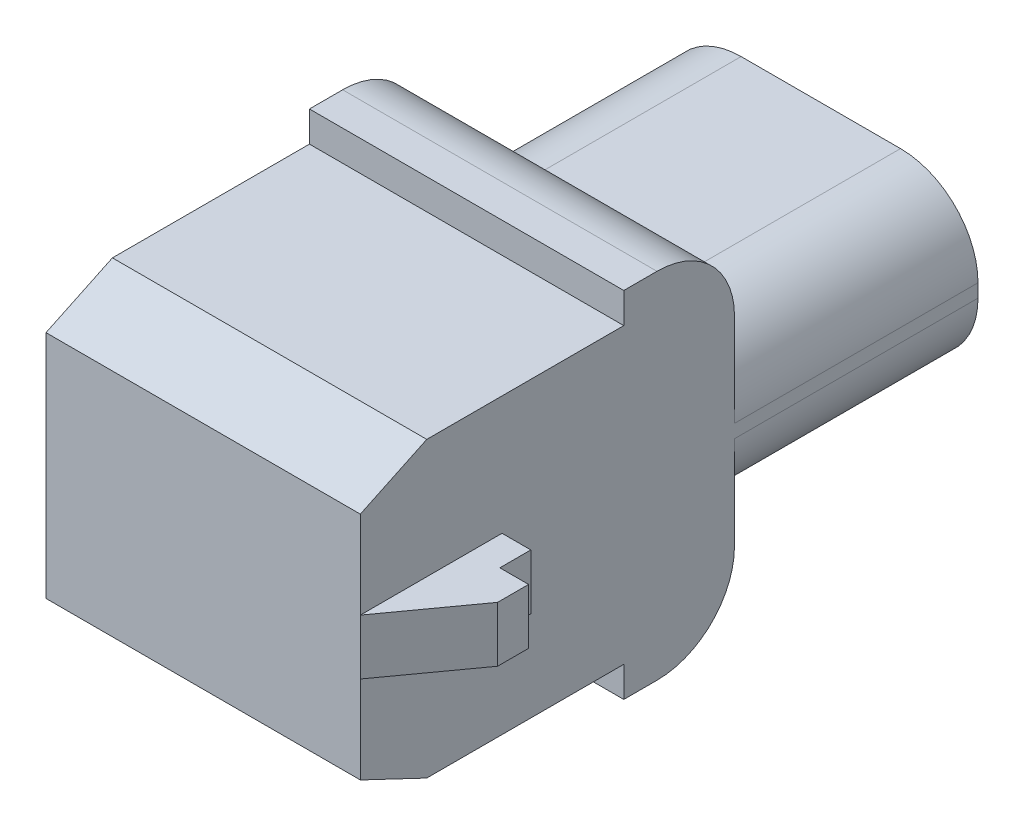
ISO-10303-21;
HEADER;
FILE_DESCRIPTION(('STEP AP214'),'2;1');
FILE_NAME('part.step','',(''),(''),'','','');
FILE_SCHEMA(('AUTOMOTIVE_DESIGN { 1 0 10303 214 1 1 1 1 }'));
ENDSEC;
DATA;
#1=APPLICATION_CONTEXT('core data for automotive mechanical design processes');
#2=APPLICATION_PROTOCOL_DEFINITION('international standard','automotive_design',2000,#1);
#3=PRODUCT_CONTEXT('',#1,'mechanical');
#4=PRODUCT('Part','Part','',(#3));
#5=PRODUCT_RELATED_PRODUCT_CATEGORY('part','',(#4));
#6=PRODUCT_DEFINITION_FORMATION('','',#4);
#7=PRODUCT_DEFINITION_CONTEXT('part definition',#1,'design');
#8=PRODUCT_DEFINITION('design','',#6,#7);
#9=PRODUCT_DEFINITION_SHAPE('','',#8);
#10=(LENGTH_UNIT() NAMED_UNIT(*) SI_UNIT(.MILLI.,.METRE.));
#11=(NAMED_UNIT(*) PLANE_ANGLE_UNIT() SI_UNIT($,.RADIAN.));
#12=(NAMED_UNIT(*) SI_UNIT($,.STERADIAN.) SOLID_ANGLE_UNIT());
#13=UNCERTAINTY_MEASURE_WITH_UNIT(LENGTH_MEASURE(1.E-05),#10,'distance_accuracy_value','');
#14=(GEOMETRIC_REPRESENTATION_CONTEXT(3) GLOBAL_UNCERTAINTY_ASSIGNED_CONTEXT((#13)) GLOBAL_UNIT_ASSIGNED_CONTEXT((#10,
#11,#12)) REPRESENTATION_CONTEXT('',''));
#15=CARTESIAN_POINT('',(0.,0.,0.));
#16=DIRECTION('',(0.,0.,1.));
#17=DIRECTION('',(1.,0.,0.));
#18=AXIS2_PLACEMENT_3D('',#15,#16,#17);
#19=CARTESIAN_POINT('',(7.1,0.,0.));
#20=DIRECTION('',(-1.,0.,0.));
#21=DIRECTION('',(0.,0.,1.));
#22=AXIS2_PLACEMENT_3D('',#19,#20,#21);
#23=PLANE('',#22);
#24=DIRECTION('',(0.,0.,1.));
#25=VECTOR('',#24,1.);
#26=CARTESIAN_POINT('',(7.1,-1.25,10.5));
#27=LINE('',#26,#25);
#28=CARTESIAN_POINT('',(7.1,-1.25,10.5));
#29=VERTEX_POINT('',#28);
#30=CARTESIAN_POINT('',(7.1,-1.25,16.9));
#31=VERTEX_POINT('',#30);
#32=EDGE_CURVE('E540',#29,#31,#27,.T.);
#33=ORIENTED_EDGE('',*,*,#32,.T.);
#34=DIRECTION('',(0.,-1.,0.));
#35=VECTOR('',#34,1.);
#36=CARTESIAN_POINT('',(7.1,5.2,16.9));
#37=LINE('',#36,#35);
#38=CARTESIAN_POINT('',(7.1,-5.2,16.9));
#39=VERTEX_POINT('',#38);
#40=EDGE_CURVE('E266',#31,#39,#37,.T.);
#41=ORIENTED_EDGE('',*,*,#40,.T.);
#42=DIRECTION('',(0.,-0.429056814568288,-0.90327750435429));
#43=VECTOR('',#42,1.);
#44=CARTESIAN_POINT('',(7.1,-6.625,13.9));
#45=LINE('',#44,#43);
#46=CARTESIAN_POINT('',(7.1,-6.625,13.9));
#47=VERTEX_POINT('',#46);
#48=EDGE_CURVE('E274',#39,#47,#45,.T.);
#49=ORIENTED_EDGE('',*,*,#48,.T.);
#50=DIRECTION('',(0.,0.,-1.));
#51=VECTOR('',#50,1.);
#52=CARTESIAN_POINT('',(7.1,-6.625,5.));
#53=LINE('',#52,#51);
#54=CARTESIAN_POINT('',(7.1,-6.625,5.));
#55=VERTEX_POINT('',#54);
#56=EDGE_CURVE('E277',#47,#55,#53,.T.);
#57=ORIENTED_EDGE('',*,*,#56,.T.);
#58=DIRECTION('',(0.,-1.,0.));
#59=VECTOR('',#58,1.);
#60=CARTESIAN_POINT('',(7.1,-8.,5.));
#61=LINE('',#60,#59);
#62=CARTESIAN_POINT('',(7.1,-8.,5.));
#63=VERTEX_POINT('',#62);
#64=EDGE_CURVE('E284',#55,#63,#61,.T.);
#65=ORIENTED_EDGE('',*,*,#64,.T.);
#66=DIRECTION('',(0.,0.,-1.));
#67=VECTOR('',#66,1.);
#68=CARTESIAN_POINT('',(7.1,-8.,0.));
#69=LINE('',#68,#67);
#70=CARTESIAN_POINT('',(7.1,-8.,3.5));
#71=VERTEX_POINT('',#70);
#72=EDGE_CURVE('E287',#63,#71,#69,.T.);
#73=ORIENTED_EDGE('',*,*,#72,.T.);
#74=CARTESIAN_POINT('',(7.1,-4.5,3.5));
#75=DIRECTION('',(-1.,0.,0.));
#76=DIRECTION('',(0.,0.,1.));
#77=AXIS2_PLACEMENT_3D('',#74,#75,#76);
#78=CIRCLE('',#77,3.5);
#79=CARTESIAN_POINT('',(7.1,-4.5,0.));
#80=VERTEX_POINT('',#79);
#81=EDGE_CURVE('E388',#71,#80,#78,.F.);
#82=ORIENTED_EDGE('',*,*,#81,.T.);
#83=DIRECTION('',(0.,1.,0.));
#84=VECTOR('',#83,1.);
#85=CARTESIAN_POINT('',(7.1,-3.8,0.));
#86=LINE('',#85,#84);
#87=CARTESIAN_POINT('',(7.1,-0.3,0.));
#88=VERTEX_POINT('',#87);
#89=EDGE_CURVE('E290',#80,#88,#86,.T.);
#90=ORIENTED_EDGE('',*,*,#89,.T.);
#91=DIRECTION('',(0.,0.,-1.));
#92=VECTOR('',#91,1.);
#93=CARTESIAN_POINT('',(7.1,-0.3,-11.));
#94=LINE('',#93,#92);
#95=CARTESIAN_POINT('',(7.1,-0.300000000000001,-11.));
#96=VERTEX_POINT('',#95);
#97=EDGE_CURVE('E393',#88,#96,#94,.T.);
#98=ORIENTED_EDGE('',*,*,#97,.T.);
#99=DIRECTION('',(0.,1.,0.));
#100=VECTOR('',#99,1.);
#101=CARTESIAN_POINT('',(7.1,-3.8,-11.));
#102=LINE('',#101,#100);
#103=CARTESIAN_POINT('',(7.1,0.299999999999998,-11.));
#104=VERTEX_POINT('',#103);
#105=EDGE_CURVE('E292',#96,#104,#102,.T.);
#106=ORIENTED_EDGE('',*,*,#105,.T.);
#107=DIRECTION('',(0.,0.,1.));
#108=VECTOR('',#107,1.);
#109=CARTESIAN_POINT('',(7.1,0.3,0.));
#110=LINE('',#109,#108);
#111=CARTESIAN_POINT('',(7.1,0.3,0.));
#112=VERTEX_POINT('',#111);
#113=EDGE_CURVE('E390',#104,#112,#110,.T.);
#114=ORIENTED_EDGE('',*,*,#113,.T.);
#115=DIRECTION('',(0.,1.,0.));
#116=VECTOR('',#115,1.);
#117=CARTESIAN_POINT('',(7.1,3.8,0.));
#118=LINE('',#117,#116);
#119=CARTESIAN_POINT('',(7.1,4.5,0.));
#120=VERTEX_POINT('',#119);
#121=EDGE_CURVE('E433',#112,#120,#118,.T.);
#122=ORIENTED_EDGE('',*,*,#121,.T.);
#123=CARTESIAN_POINT('',(7.1,4.5,3.5));
#124=DIRECTION('',(-1.,0.,0.));
#125=DIRECTION('',(0.,0.,1.));
#126=AXIS2_PLACEMENT_3D('',#123,#124,#125);
#127=CIRCLE('',#126,3.5);
#128=CARTESIAN_POINT('',(7.1,8.,3.5));
#129=VERTEX_POINT('',#128);
#130=EDGE_CURVE('E386',#120,#129,#127,.F.);
#131=ORIENTED_EDGE('',*,*,#130,.T.);
#132=DIRECTION('',(0.,0.,1.));
#133=VECTOR('',#132,1.);
#134=CARTESIAN_POINT('',(7.1,8.,0.));
#135=LINE('',#134,#133);
#136=CARTESIAN_POINT('',(7.1,8.,5.));
#137=VERTEX_POINT('',#136);
#138=EDGE_CURVE('E436',#129,#137,#135,.T.);
#139=ORIENTED_EDGE('',*,*,#138,.T.);
#140=DIRECTION('',(0.,-1.,0.));
#141=VECTOR('',#140,1.);
#142=CARTESIAN_POINT('',(7.1,8.,5.));
#143=LINE('',#142,#141);
#144=CARTESIAN_POINT('',(7.1,6.625,5.));
#145=VERTEX_POINT('',#144);
#146=EDGE_CURVE('E439',#137,#145,#143,.T.);
#147=ORIENTED_EDGE('',*,*,#146,.T.);
#148=DIRECTION('',(0.,0.,1.));
#149=VECTOR('',#148,1.);
#150=CARTESIAN_POINT('',(7.1,6.625,5.));
#151=LINE('',#150,#149);
#152=CARTESIAN_POINT('',(7.1,6.625,13.9));
#153=VERTEX_POINT('',#152);
#154=EDGE_CURVE('E449',#145,#153,#151,.T.);
#155=ORIENTED_EDGE('',*,*,#154,.T.);
#156=DIRECTION('',(0.,-0.429056814568288,0.90327750435429));
#157=VECTOR('',#156,1.);
#158=CARTESIAN_POINT('',(7.1,6.625,13.9));
#159=LINE('',#158,#157);
#160=CARTESIAN_POINT('',(7.1,5.2,16.9));
#161=VERTEX_POINT('',#160);
#162=EDGE_CURVE('E273',#153,#161,#159,.T.);
#163=ORIENTED_EDGE('',*,*,#162,.T.);
#164=CARTESIAN_POINT('',(7.1,1.25,16.9));
#165=VERTEX_POINT('',#164);
#166=EDGE_CURVE('E265',#161,#165,#37,.T.);
#167=ORIENTED_EDGE('',*,*,#166,.T.);
#168=DIRECTION('',(0.,0.,1.));
#169=VECTOR('',#168,1.);
#170=CARTESIAN_POINT('',(7.1,1.25,10.5));
#171=LINE('',#170,#169);
#172=CARTESIAN_POINT('',(7.1,1.25,10.5));
#173=VERTEX_POINT('',#172);
#174=EDGE_CURVE('E241',#173,#165,#171,.T.);
#175=ORIENTED_EDGE('',*,*,#174,.F.);
#176=DIRECTION('',(0.,1.,0.));
#177=VECTOR('',#176,1.);
#178=CARTESIAN_POINT('',(7.1,-1.25,10.5));
#179=LINE('',#178,#177);
#180=EDGE_CURVE('E267',#29,#173,#179,.T.);
#181=ORIENTED_EDGE('',*,*,#180,.F.);
#182=EDGE_LOOP('',(#33,#41,#49,#57,#65,#73,#82,#90,#98,#106,#114,#122,#131,#139,#147,#155,#163,
#167,#175,#181));
#183=FACE_BOUND('',#182,.T.);
#184=ADVANCED_FACE('F33',(#183),#23,.F.);
#185=CARTESIAN_POINT('',(-7.1,0.,0.));
#186=DIRECTION('',(-1.,0.,0.));
#187=DIRECTION('',(0.,0.,1.));
#188=AXIS2_PLACEMENT_3D('',#185,#186,#187);
#189=PLANE('',#188);
#190=DIRECTION('',(0.,-1.,0.));
#191=VECTOR('',#190,1.);
#192=CARTESIAN_POINT('',(-7.1,5.2,16.9));
#193=LINE('',#192,#191);
#194=CARTESIAN_POINT('',(-7.1,-1.25,16.9));
#195=VERTEX_POINT('',#194);
#196=CARTESIAN_POINT('',(-7.1,-5.2,16.9));
#197=VERTEX_POINT('',#196);
#198=EDGE_CURVE('E309',#195,#197,#193,.T.);
#199=ORIENTED_EDGE('',*,*,#198,.F.);
#200=DIRECTION('',(0.,0.,-1.));
#201=VECTOR('',#200,1.);
#202=CARTESIAN_POINT('',(-7.1,-1.25,10.5));
#203=LINE('',#202,#201);
#204=CARTESIAN_POINT('',(-7.1,-1.25,10.5));
#205=VERTEX_POINT('',#204);
#206=EDGE_CURVE('E56',#195,#205,#203,.T.);
#207=ORIENTED_EDGE('',*,*,#206,.T.);
#208=DIRECTION('',(0.,1.,0.));
#209=VECTOR('',#208,1.);
#210=CARTESIAN_POINT('',(-7.1,-1.25,10.5));
#211=LINE('',#210,#209);
#212=CARTESIAN_POINT('',(-7.1,1.25,10.5));
#213=VERTEX_POINT('',#212);
#214=EDGE_CURVE('E445',#205,#213,#211,.T.);
#215=ORIENTED_EDGE('',*,*,#214,.T.);
#216=DIRECTION('',(0.,0.,-1.));
#217=VECTOR('',#216,1.);
#218=CARTESIAN_POINT('',(-7.1,1.25,10.5));
#219=LINE('',#218,#217);
#220=CARTESIAN_POINT('',(-7.1,1.25,16.9));
#221=VERTEX_POINT('',#220);
#222=EDGE_CURVE('E461',#221,#213,#219,.T.);
#223=ORIENTED_EDGE('',*,*,#222,.F.);
#224=CARTESIAN_POINT('',(-7.1,5.2,16.9));
#225=VERTEX_POINT('',#224);
#226=EDGE_CURVE('E310',#225,#221,#193,.T.);
#227=ORIENTED_EDGE('',*,*,#226,.F.);
#228=DIRECTION('',(0.,-0.429056814568288,0.90327750435429));
#229=VECTOR('',#228,1.);
#230=CARTESIAN_POINT('',(-7.1,6.625,13.9));
#231=LINE('',#230,#229);
#232=CARTESIAN_POINT('',(-7.1,6.625,13.9));
#233=VERTEX_POINT('',#232);
#234=EDGE_CURVE('E306',#233,#225,#231,.T.);
#235=ORIENTED_EDGE('',*,*,#234,.F.);
#236=DIRECTION('',(0.,0.,1.));
#237=VECTOR('',#236,1.);
#238=CARTESIAN_POINT('',(-7.1,6.625,5.));
#239=LINE('',#238,#237);
#240=CARTESIAN_POINT('',(-7.1,6.625,5.));
#241=VERTEX_POINT('',#240);
#242=EDGE_CURVE('E303',#241,#233,#239,.T.);
#243=ORIENTED_EDGE('',*,*,#242,.F.);
#244=DIRECTION('',(0.,-1.,0.));
#245=VECTOR('',#244,1.);
#246=CARTESIAN_POINT('',(-7.1,8.,5.));
#247=LINE('',#246,#245);
#248=CARTESIAN_POINT('',(-7.1,8.,5.));
#249=VERTEX_POINT('',#248);
#250=EDGE_CURVE('E300',#249,#241,#247,.T.);
#251=ORIENTED_EDGE('',*,*,#250,.F.);
#252=DIRECTION('',(0.,0.,1.));
#253=VECTOR('',#252,1.);
#254=CARTESIAN_POINT('',(-7.1,8.,0.));
#255=LINE('',#254,#253);
#256=CARTESIAN_POINT('',(-7.1,8.,3.5));
#257=VERTEX_POINT('',#256);
#258=EDGE_CURVE('E298',#257,#249,#255,.T.);
#259=ORIENTED_EDGE('',*,*,#258,.F.);
#260=CARTESIAN_POINT('',(-7.1,4.5,3.5));
#261=DIRECTION('',(-1.,0.,0.));
#262=DIRECTION('',(0.,0.,1.));
#263=AXIS2_PLACEMENT_3D('',#260,#261,#262);
#264=CIRCLE('',#263,3.5);
#265=CARTESIAN_POINT('',(-7.1,4.5,0.));
#266=VERTEX_POINT('',#265);
#267=EDGE_CURVE('E364',#257,#266,#264,.T.);
#268=ORIENTED_EDGE('',*,*,#267,.T.);
#269=DIRECTION('',(0.,1.,0.));
#270=VECTOR('',#269,1.);
#271=CARTESIAN_POINT('',(-7.1,3.8,0.));
#272=LINE('',#271,#270);
#273=CARTESIAN_POINT('',(-7.1,0.3,0.));
#274=VERTEX_POINT('',#273);
#275=EDGE_CURVE('E295',#274,#266,#272,.T.);
#276=ORIENTED_EDGE('',*,*,#275,.F.);
#277=DIRECTION('',(0.,0.,1.));
#278=VECTOR('',#277,1.);
#279=CARTESIAN_POINT('',(-7.1,0.3,0.));
#280=LINE('',#279,#278);
#281=CARTESIAN_POINT('',(-7.1,0.299999999999998,-11.));
#282=VERTEX_POINT('',#281);
#283=EDGE_CURVE('E371',#274,#282,#280,.F.);
#284=ORIENTED_EDGE('',*,*,#283,.T.);
#285=DIRECTION('',(0.,1.,0.));
#286=VECTOR('',#285,1.);
#287=CARTESIAN_POINT('',(-7.1,-3.8,-11.));
#288=LINE('',#287,#286);
#289=CARTESIAN_POINT('',(-7.1,-0.300000000000001,-11.));
#290=VERTEX_POINT('',#289);
#291=EDGE_CURVE('E327',#290,#282,#288,.T.);
#292=ORIENTED_EDGE('',*,*,#291,.F.);
#293=DIRECTION('',(0.,0.,-1.));
#294=VECTOR('',#293,1.);
#295=CARTESIAN_POINT('',(-7.1,-0.3,0.));
#296=LINE('',#295,#294);
#297=CARTESIAN_POINT('',(-7.1,-0.3,0.));
#298=VERTEX_POINT('',#297);
#299=EDGE_CURVE('E368',#290,#298,#296,.F.);
#300=ORIENTED_EDGE('',*,*,#299,.T.);
#301=DIRECTION('',(0.,1.,0.));
#302=VECTOR('',#301,1.);
#303=CARTESIAN_POINT('',(-7.1,-3.8,0.));
#304=LINE('',#303,#302);
#305=CARTESIAN_POINT('',(-7.1,-4.5,0.));
#306=VERTEX_POINT('',#305);
#307=EDGE_CURVE('E325',#306,#298,#304,.T.);
#308=ORIENTED_EDGE('',*,*,#307,.F.);
#309=CARTESIAN_POINT('',(-7.1,-4.5,3.5));
#310=DIRECTION('',(-1.,0.,0.));
#311=DIRECTION('',(0.,0.,1.));
#312=AXIS2_PLACEMENT_3D('',#309,#310,#311);
#313=CIRCLE('',#312,3.5);
#314=CARTESIAN_POINT('',(-7.1,-8.,3.5));
#315=VERTEX_POINT('',#314);
#316=EDGE_CURVE('E366',#306,#315,#313,.T.);
#317=ORIENTED_EDGE('',*,*,#316,.T.);
#318=DIRECTION('',(0.,0.,-1.));
#319=VECTOR('',#318,1.);
#320=CARTESIAN_POINT('',(-7.1,-8.,0.));
#321=LINE('',#320,#319);
#322=CARTESIAN_POINT('',(-7.1,-8.,5.));
#323=VERTEX_POINT('',#322);
#324=EDGE_CURVE('E322',#323,#315,#321,.T.);
#325=ORIENTED_EDGE('',*,*,#324,.F.);
#326=DIRECTION('',(0.,-1.,0.));
#327=VECTOR('',#326,1.);
#328=CARTESIAN_POINT('',(-7.1,-8.,5.));
#329=LINE('',#328,#327);
#330=CARTESIAN_POINT('',(-7.1,-6.625,5.));
#331=VERTEX_POINT('',#330);
#332=EDGE_CURVE('E319',#331,#323,#329,.T.);
#333=ORIENTED_EDGE('',*,*,#332,.F.);
#334=DIRECTION('',(0.,0.,-1.));
#335=VECTOR('',#334,1.);
#336=CARTESIAN_POINT('',(-7.1,-6.625,5.));
#337=LINE('',#336,#335);
#338=CARTESIAN_POINT('',(-7.1,-6.625,13.9));
#339=VERTEX_POINT('',#338);
#340=EDGE_CURVE('E316',#339,#331,#337,.T.);
#341=ORIENTED_EDGE('',*,*,#340,.F.);
#342=DIRECTION('',(0.,-0.429056814568288,-0.90327750435429));
#343=VECTOR('',#342,1.);
#344=CARTESIAN_POINT('',(-7.1,-6.625,13.9));
#345=LINE('',#344,#343);
#346=EDGE_CURVE('E313',#197,#339,#345,.T.);
#347=ORIENTED_EDGE('',*,*,#346,.F.);
#348=EDGE_LOOP('',(#199,#207,#215,#223,#227,#235,#243,#251,#259,#268,#276,#284,#292,#300,#308,
#317,#325,#333,#341,#347));
#349=FACE_BOUND('',#348,.T.);
#350=ADVANCED_FACE('F458',(#349),#189,.T.);
#351=CARTESIAN_POINT('',(-7.1,3.8,-11.));
#352=DIRECTION('',(0.,1.,0.));
#353=DIRECTION('',(0.,0.,1.));
#354=AXIS2_PLACEMENT_3D('',#351,#352,#353);
#355=PLANE('',#354);
#356=DIRECTION('',(1.,0.,0.));
#357=VECTOR('',#356,1.);
#358=CARTESIAN_POINT('',(-7.1,3.8,-11.));
#359=LINE('',#358,#357);
#360=CARTESIAN_POINT('',(-3.6,3.8,-11.));
#361=VERTEX_POINT('',#360);
#362=CARTESIAN_POINT('',(3.6,3.8,-11.));
#363=VERTEX_POINT('',#362);
#364=EDGE_CURVE('E331',#361,#363,#359,.T.);
#365=ORIENTED_EDGE('',*,*,#364,.F.);
#366=DIRECTION('',(0.,0.,1.));
#367=VECTOR('',#366,1.);
#368=CARTESIAN_POINT('',(-3.6,3.8,-11.));
#369=LINE('',#368,#367);
#370=CARTESIAN_POINT('',(-3.6,3.8,0.));
#371=VERTEX_POINT('',#370);
#372=EDGE_CURVE('E361',#361,#371,#369,.T.);
#373=ORIENTED_EDGE('',*,*,#372,.T.);
#374=DIRECTION('',(1.,0.,0.));
#375=VECTOR('',#374,1.);
#376=CARTESIAN_POINT('',(-7.1,3.8,0.));
#377=LINE('',#376,#375);
#378=CARTESIAN_POINT('',(3.6,3.8,0.));
#379=VERTEX_POINT('',#378);
#380=EDGE_CURVE('E330',#371,#379,#377,.T.);
#381=ORIENTED_EDGE('',*,*,#380,.T.);
#382=DIRECTION('',(0.,0.,1.));
#383=VECTOR('',#382,1.);
#384=CARTESIAN_POINT('',(3.6,3.8,-11.));
#385=LINE('',#384,#383);
#386=EDGE_CURVE('E334',#379,#363,#385,.F.);
#387=ORIENTED_EDGE('',*,*,#386,.T.);
#388=EDGE_LOOP('',(#365,#373,#381,#387));
#389=FACE_BOUND('',#388,.T.);
#390=ADVANCED_FACE('F597',(#389),#355,.T.);
#391=CARTESIAN_POINT('',(-7.1,-3.8,-11.));
#392=DIRECTION('',(0.,0.,-1.));
#393=DIRECTION('',(-1.,0.,0.));
#394=AXIS2_PLACEMENT_3D('',#391,#392,#393);
#395=PLANE('',#394);
#396=ORIENTED_EDGE('',*,*,#291,.T.);
#397=CARTESIAN_POINT('',(-3.6,0.3,-11.));
#398=DIRECTION('',(0.,0.,-1.));
#399=DIRECTION('',(-1.,0.,0.));
#400=AXIS2_PLACEMENT_3D('',#397,#398,#399);
#401=CIRCLE('',#400,3.5);
#402=EDGE_CURVE('E379',#282,#361,#401,.T.);
#403=ORIENTED_EDGE('',*,*,#402,.T.);
#404=ORIENTED_EDGE('',*,*,#364,.T.);
#405=CARTESIAN_POINT('',(3.6,0.3,-11.));
#406=DIRECTION('',(0.,0.,-1.));
#407=DIRECTION('',(-1.,0.,0.));
#408=AXIS2_PLACEMENT_3D('',#405,#406,#407);
#409=CIRCLE('',#408,3.5);
#410=EDGE_CURVE('E373',#363,#104,#409,.T.);
#411=ORIENTED_EDGE('',*,*,#410,.T.);
#412=ORIENTED_EDGE('',*,*,#105,.F.);
#413=CARTESIAN_POINT('',(3.6,-0.3,-11.));
#414=DIRECTION('',(0.,0.,-1.));
#415=DIRECTION('',(-1.,0.,0.));
#416=AXIS2_PLACEMENT_3D('',#413,#414,#415);
#417=CIRCLE('',#416,3.5);
#418=CARTESIAN_POINT('',(3.6,-3.8,-11.));
#419=VERTEX_POINT('',#418);
#420=EDGE_CURVE('E375',#96,#419,#417,.T.);
#421=ORIENTED_EDGE('',*,*,#420,.T.);
#422=DIRECTION('',(1.,0.,0.));
#423=VECTOR('',#422,1.);
#424=CARTESIAN_POINT('',(-7.1,-3.8,-11.));
#425=LINE('',#424,#423);
#426=CARTESIAN_POINT('',(-3.6,-3.8,-11.));
#427=VERTEX_POINT('',#426);
#428=EDGE_CURVE('E335',#427,#419,#425,.T.);
#429=ORIENTED_EDGE('',*,*,#428,.F.);
#430=CARTESIAN_POINT('',(-3.6,-0.3,-11.));
#431=DIRECTION('',(0.,0.,-1.));
#432=DIRECTION('',(-1.,0.,0.));
#433=AXIS2_PLACEMENT_3D('',#430,#431,#432);
#434=CIRCLE('',#433,3.5);
#435=EDGE_CURVE('E377',#427,#290,#434,.T.);
#436=ORIENTED_EDGE('',*,*,#435,.T.);
#437=EDGE_LOOP('',(#396,#403,#404,#411,#412,#421,#429,#436));
#438=FACE_BOUND('',#437,.T.);
#439=ADVANCED_FACE('F424',(#438),#395,.T.);
#440=CARTESIAN_POINT('',(-7.1,-3.8,-11.));
#441=DIRECTION('',(0.,-1.,0.));
#442=DIRECTION('',(0.,0.,-1.));
#443=AXIS2_PLACEMENT_3D('',#440,#441,#442);
#444=PLANE('',#443);
#445=DIRECTION('',(1.,0.,0.));
#446=VECTOR('',#445,1.);
#447=CARTESIAN_POINT('',(-7.1,-3.8,0.));
#448=LINE('',#447,#446);
#449=CARTESIAN_POINT('',(-3.6,-3.8,0.));
#450=VERTEX_POINT('',#449);
#451=CARTESIAN_POINT('',(3.6,-3.8,0.));
#452=VERTEX_POINT('',#451);
#453=EDGE_CURVE('E338',#450,#452,#448,.T.);
#454=ORIENTED_EDGE('',*,*,#453,.F.);
#455=DIRECTION('',(0.,0.,-1.));
#456=VECTOR('',#455,1.);
#457=CARTESIAN_POINT('',(-3.6,-3.8,-11.));
#458=LINE('',#457,#456);
#459=EDGE_CURVE('E383',#450,#427,#458,.T.);
#460=ORIENTED_EDGE('',*,*,#459,.T.);
#461=ORIENTED_EDGE('',*,*,#428,.T.);
#462=DIRECTION('',(0.,0.,-1.));
#463=VECTOR('',#462,1.);
#464=CARTESIAN_POINT('',(3.6,-3.8,0.));
#465=LINE('',#464,#463);
#466=EDGE_CURVE('E381',#419,#452,#465,.F.);
#467=ORIENTED_EDGE('',*,*,#466,.T.);
#468=EDGE_LOOP('',(#454,#460,#461,#467));
#469=FACE_BOUND('',#468,.T.);
#470=ADVANCED_FACE('F604',(#469),#444,.T.);
#471=CARTESIAN_POINT('',(-7.1,-3.8,0.));
#472=DIRECTION('',(0.,0.,-1.));
#473=DIRECTION('',(0.,1.,0.));
#474=AXIS2_PLACEMENT_3D('',#471,#472,#473);
#475=PLANE('',#474);
#476=ORIENTED_EDGE('',*,*,#89,.F.);
#477=DIRECTION('',(1.,0.,0.));
#478=VECTOR('',#477,1.);
#479=CARTESIAN_POINT('',(-7.1,-4.5,0.));
#480=LINE('',#479,#478);
#481=EDGE_CURVE('E399',#80,#306,#480,.F.);
#482=ORIENTED_EDGE('',*,*,#481,.T.);
#483=ORIENTED_EDGE('',*,*,#307,.T.);
#484=CARTESIAN_POINT('',(-3.6,-0.3,0.));
#485=DIRECTION('',(0.,0.,-1.));
#486=DIRECTION('',(0.,1.,0.));
#487=AXIS2_PLACEMENT_3D('',#484,#485,#486);
#488=CIRCLE('',#487,3.5);
#489=EDGE_CURVE('E409',#298,#450,#488,.F.);
#490=ORIENTED_EDGE('',*,*,#489,.T.);
#491=ORIENTED_EDGE('',*,*,#453,.T.);
#492=CARTESIAN_POINT('',(3.6,-0.3,0.));
#493=DIRECTION('',(0.,0.,-1.));
#494=DIRECTION('',(0.,1.,0.));
#495=AXIS2_PLACEMENT_3D('',#492,#493,#494);
#496=CIRCLE('',#495,3.5);
#497=EDGE_CURVE('E41',#452,#88,#496,.F.);
#498=ORIENTED_EDGE('',*,*,#497,.T.);
#499=EDGE_LOOP('',(#476,#482,#483,#490,#491,#498));
#500=FACE_BOUND('',#499,.T.);
#501=ADVANCED_FACE('F415',(#500),#475,.T.);
#502=CARTESIAN_POINT('',(-7.1,-8.,0.));
#503=DIRECTION('',(0.,-1.,0.));
#504=DIRECTION('',(0.,0.,-1.));
#505=AXIS2_PLACEMENT_3D('',#502,#503,#504);
#506=PLANE('',#505);
#507=ORIENTED_EDGE('',*,*,#324,.T.);
#508=DIRECTION('',(1.,0.,0.));
#509=VECTOR('',#508,1.);
#510=CARTESIAN_POINT('',(-7.1,-8.,3.5));
#511=LINE('',#510,#509);
#512=EDGE_CURVE('E396',#315,#71,#511,.T.);
#513=ORIENTED_EDGE('',*,*,#512,.T.);
#514=ORIENTED_EDGE('',*,*,#72,.F.);
#515=DIRECTION('',(1.,0.,0.));
#516=VECTOR('',#515,1.);
#517=CARTESIAN_POINT('',(-7.1,-8.,5.));
#518=LINE('',#517,#516);
#519=EDGE_CURVE('E341',#323,#63,#518,.T.);
#520=ORIENTED_EDGE('',*,*,#519,.F.);
#521=EDGE_LOOP('',(#507,#513,#514,#520));
#522=FACE_BOUND('',#521,.T.);
#523=ADVANCED_FACE('F610',(#522),#506,.T.);
#524=CARTESIAN_POINT('',(-7.1,-8.,5.));
#525=DIRECTION('',(0.,0.,1.));
#526=DIRECTION('',(0.,-1.,0.));
#527=AXIS2_PLACEMENT_3D('',#524,#525,#526);
#528=PLANE('',#527);
#529=ORIENTED_EDGE('',*,*,#519,.T.);
#530=ORIENTED_EDGE('',*,*,#64,.F.);
#531=DIRECTION('',(1.,0.,0.));
#532=VECTOR('',#531,1.);
#533=CARTESIAN_POINT('',(-7.1,-6.625,5.));
#534=LINE('',#533,#532);
#535=EDGE_CURVE('E343',#331,#55,#534,.T.);
#536=ORIENTED_EDGE('',*,*,#535,.F.);
#537=ORIENTED_EDGE('',*,*,#332,.T.);
#538=EDGE_LOOP('',(#529,#530,#536,#537));
#539=FACE_BOUND('',#538,.T.);
#540=ADVANCED_FACE('F613',(#539),#528,.T.);
#541=CARTESIAN_POINT('',(-7.1,-6.625,5.));
#542=DIRECTION('',(0.,-1.,0.));
#543=DIRECTION('',(0.,0.,-1.));
#544=AXIS2_PLACEMENT_3D('',#541,#542,#543);
#545=PLANE('',#544);
#546=ORIENTED_EDGE('',*,*,#535,.T.);
#547=ORIENTED_EDGE('',*,*,#56,.F.);
#548=DIRECTION('',(1.,0.,0.));
#549=VECTOR('',#548,1.);
#550=CARTESIAN_POINT('',(-7.1,-6.625,13.9));
#551=LINE('',#550,#549);
#552=EDGE_CURVE('E345',#339,#47,#551,.T.);
#553=ORIENTED_EDGE('',*,*,#552,.F.);
#554=ORIENTED_EDGE('',*,*,#340,.T.);
#555=EDGE_LOOP('',(#546,#547,#553,#554));
#556=FACE_BOUND('',#555,.T.);
#557=ADVANCED_FACE('F537',(#556),#545,.T.);
#558=CARTESIAN_POINT('',(-7.1,-6.625,13.9));
#559=DIRECTION('',(0.,-0.90327750435429,0.429056814568288));
#560=DIRECTION('',(0.,-0.429056814568288,-0.90327750435429));
#561=AXIS2_PLACEMENT_3D('',#558,#559,#560);
#562=PLANE('',#561);
#563=ORIENTED_EDGE('',*,*,#552,.T.);
#564=ORIENTED_EDGE('',*,*,#48,.F.);
#565=DIRECTION('',(1.,0.,0.));
#566=VECTOR('',#565,1.);
#567=CARTESIAN_POINT('',(-7.1,-5.2,16.9));
#568=LINE('',#567,#566);
#569=EDGE_CURVE('E347',#197,#39,#568,.T.);
#570=ORIENTED_EDGE('',*,*,#569,.F.);
#571=ORIENTED_EDGE('',*,*,#346,.T.);
#572=EDGE_LOOP('',(#563,#564,#570,#571));
#573=FACE_BOUND('',#572,.T.);
#574=ADVANCED_FACE('F532',(#573),#562,.T.);
#575=CARTESIAN_POINT('',(-7.1,5.2,16.9));
#576=DIRECTION('',(0.,0.,1.));
#577=DIRECTION('',(1.,0.,0.));
#578=AXIS2_PLACEMENT_3D('',#575,#576,#577);
#579=PLANE('',#578);
#580=ORIENTED_EDGE('',*,*,#569,.T.);
#581=ORIENTED_EDGE('',*,*,#40,.F.);
#582=DIRECTION('',(0.,1.,0.));
#583=VECTOR('',#582,1.);
#584=CARTESIAN_POINT('',(7.1,-1.25,16.9));
#585=LINE('',#584,#583);
#586=EDGE_CURVE('E255',#31,#165,#585,.T.);
#587=ORIENTED_EDGE('',*,*,#586,.T.);
#588=ORIENTED_EDGE('',*,*,#166,.F.);
#589=DIRECTION('',(1.,0.,0.));
#590=VECTOR('',#589,1.);
#591=CARTESIAN_POINT('',(-7.1,5.2,16.9));
#592=LINE('',#591,#590);
#593=EDGE_CURVE('E349',#225,#161,#592,.T.);
#594=ORIENTED_EDGE('',*,*,#593,.F.);
#595=ORIENTED_EDGE('',*,*,#226,.T.);
#596=DIRECTION('',(0.,1.,0.));
#597=VECTOR('',#596,1.);
#598=CARTESIAN_POINT('',(-7.1,-1.25,16.9));
#599=LINE('',#598,#597);
#600=EDGE_CURVE('E437',#195,#221,#599,.T.);
#601=ORIENTED_EDGE('',*,*,#600,.F.);
#602=ORIENTED_EDGE('',*,*,#198,.T.);
#603=EDGE_LOOP('',(#580,#581,#587,#588,#594,#595,#601,#602));
#604=FACE_BOUND('',#603,.T.);
#605=ADVANCED_FACE('F264',(#604),#579,.T.);
#606=CARTESIAN_POINT('',(-7.1,6.625,13.9));
#607=DIRECTION('',(0.,0.90327750435429,0.429056814568288));
#608=DIRECTION('',(0.,-0.429056814568288,0.90327750435429));
#609=AXIS2_PLACEMENT_3D('',#606,#607,#608);
#610=PLANE('',#609);
#611=ORIENTED_EDGE('',*,*,#593,.T.);
#612=ORIENTED_EDGE('',*,*,#162,.F.);
#613=DIRECTION('',(1.,0.,0.));
#614=VECTOR('',#613,1.);
#615=CARTESIAN_POINT('',(-7.1,6.625,13.9));
#616=LINE('',#615,#614);
#617=EDGE_CURVE('E351',#233,#153,#616,.T.);
#618=ORIENTED_EDGE('',*,*,#617,.F.);
#619=ORIENTED_EDGE('',*,*,#234,.T.);
#620=EDGE_LOOP('',(#611,#612,#618,#619));
#621=FACE_BOUND('',#620,.T.);
#622=ADVANCED_FACE('F454',(#621),#610,.T.);
#623=CARTESIAN_POINT('',(-7.1,6.625,5.));
#624=DIRECTION('',(0.,1.,0.));
#625=DIRECTION('',(0.,0.,1.));
#626=AXIS2_PLACEMENT_3D('',#623,#624,#625);
#627=PLANE('',#626);
#628=ORIENTED_EDGE('',*,*,#617,.T.);
#629=ORIENTED_EDGE('',*,*,#154,.F.);
#630=DIRECTION('',(1.,0.,0.));
#631=VECTOR('',#630,1.);
#632=CARTESIAN_POINT('',(-7.1,6.625,5.));
#633=LINE('',#632,#631);
#634=EDGE_CURVE('E353',#241,#145,#633,.T.);
#635=ORIENTED_EDGE('',*,*,#634,.F.);
#636=ORIENTED_EDGE('',*,*,#242,.T.);
#637=EDGE_LOOP('',(#628,#629,#635,#636));
#638=FACE_BOUND('',#637,.T.);
#639=ADVANCED_FACE('F626',(#638),#627,.T.);
#640=CARTESIAN_POINT('',(-7.1,8.,5.));
#641=DIRECTION('',(0.,0.,1.));
#642=DIRECTION('',(0.,-1.,0.));
#643=AXIS2_PLACEMENT_3D('',#640,#641,#642);
#644=PLANE('',#643);
#645=ORIENTED_EDGE('',*,*,#634,.T.);
#646=ORIENTED_EDGE('',*,*,#146,.F.);
#647=DIRECTION('',(1.,0.,0.));
#648=VECTOR('',#647,1.);
#649=CARTESIAN_POINT('',(-7.1,8.,5.));
#650=LINE('',#649,#648);
#651=EDGE_CURVE('E355',#249,#137,#650,.T.);
#652=ORIENTED_EDGE('',*,*,#651,.F.);
#653=ORIENTED_EDGE('',*,*,#250,.T.);
#654=EDGE_LOOP('',(#645,#646,#652,#653));
#655=FACE_BOUND('',#654,.T.);
#656=ADVANCED_FACE('F629',(#655),#644,.T.);
#657=CARTESIAN_POINT('',(-7.1,8.,0.));
#658=DIRECTION('',(0.,1.,0.));
#659=DIRECTION('',(0.,0.,1.));
#660=AXIS2_PLACEMENT_3D('',#657,#658,#659);
#661=PLANE('',#660);
#662=ORIENTED_EDGE('',*,*,#138,.F.);
#663=DIRECTION('',(1.,0.,0.));
#664=VECTOR('',#663,1.);
#665=CARTESIAN_POINT('',(-7.1,8.,3.5));
#666=LINE('',#665,#664);
#667=EDGE_CURVE('E404',#129,#257,#666,.F.);
#668=ORIENTED_EDGE('',*,*,#667,.T.);
#669=ORIENTED_EDGE('',*,*,#258,.T.);
#670=ORIENTED_EDGE('',*,*,#651,.T.);
#671=EDGE_LOOP('',(#662,#668,#669,#670));
#672=FACE_BOUND('',#671,.T.);
#673=ADVANCED_FACE('F632',(#672),#661,.T.);
#674=CARTESIAN_POINT('',(-7.1,3.8,0.));
#675=DIRECTION('',(0.,0.,-1.));
#676=DIRECTION('',(0.,1.,0.));
#677=AXIS2_PLACEMENT_3D('',#674,#675,#676);
#678=PLANE('',#677);
#679=ORIENTED_EDGE('',*,*,#275,.T.);
#680=DIRECTION('',(1.,0.,0.));
#681=VECTOR('',#680,1.);
#682=CARTESIAN_POINT('',(-7.1,4.5,0.));
#683=LINE('',#682,#681);
#684=EDGE_CURVE('E401',#266,#120,#683,.T.);
#685=ORIENTED_EDGE('',*,*,#684,.T.);
#686=ORIENTED_EDGE('',*,*,#121,.F.);
#687=CARTESIAN_POINT('',(3.6,0.3,0.));
#688=DIRECTION('',(0.,0.,-1.));
#689=DIRECTION('',(0.,1.,0.));
#690=AXIS2_PLACEMENT_3D('',#687,#688,#689);
#691=CIRCLE('',#690,3.5);
#692=EDGE_CURVE('E11',#112,#379,#691,.F.);
#693=ORIENTED_EDGE('',*,*,#692,.T.);
#694=ORIENTED_EDGE('',*,*,#380,.F.);
#695=CARTESIAN_POINT('',(-3.6,0.3,0.));
#696=DIRECTION('',(0.,0.,-1.));
#697=DIRECTION('',(0.,1.,0.));
#698=AXIS2_PLACEMENT_3D('',#695,#696,#697);
#699=CIRCLE('',#698,3.5);
#700=EDGE_CURVE('E406',#371,#274,#699,.F.);
#701=ORIENTED_EDGE('',*,*,#700,.T.);
#702=EDGE_LOOP('',(#679,#685,#686,#693,#694,#701));
#703=FACE_BOUND('',#702,.T.);
#704=ADVANCED_FACE('F636',(#703),#678,.T.);
#705=CARTESIAN_POINT('',(-3.6,0.3,-11.));
#706=DIRECTION('',(0.,0.,1.));
#707=DIRECTION('',(1.,0.,0.));
#708=AXIS2_PLACEMENT_3D('',#705,#706,#707);
#709=CYLINDRICAL_SURFACE('',#708,3.5);
#710=ORIENTED_EDGE('',*,*,#402,.F.);
#711=ORIENTED_EDGE('',*,*,#283,.F.);
#712=ORIENTED_EDGE('',*,*,#700,.F.);
#713=ORIENTED_EDGE('',*,*,#372,.F.);
#714=EDGE_LOOP('',(#710,#711,#712,#713));
#715=FACE_BOUND('',#714,.T.);
#716=ADVANCED_FACE('F640',(#715),#709,.T.);
#717=CARTESIAN_POINT('',(-3.6,-0.3,-11.));
#718=DIRECTION('',(0.,0.,-1.));
#719=DIRECTION('',(-1.,0.,0.));
#720=AXIS2_PLACEMENT_3D('',#717,#718,#719);
#721=CYLINDRICAL_SURFACE('',#720,3.5);
#722=ORIENTED_EDGE('',*,*,#489,.F.);
#723=ORIENTED_EDGE('',*,*,#299,.F.);
#724=ORIENTED_EDGE('',*,*,#435,.F.);
#725=ORIENTED_EDGE('',*,*,#459,.F.);
#726=EDGE_LOOP('',(#722,#723,#724,#725));
#727=FACE_BOUND('',#726,.T.);
#728=ADVANCED_FACE('F646',(#727),#721,.T.);
#729=CARTESIAN_POINT('',(3.6,-0.3,0.));
#730=DIRECTION('',(0.,0.,1.));
#731=DIRECTION('',(1.,0.,0.));
#732=AXIS2_PLACEMENT_3D('',#729,#730,#731);
#733=CYLINDRICAL_SURFACE('',#732,3.5);
#734=ORIENTED_EDGE('',*,*,#497,.F.);
#735=ORIENTED_EDGE('',*,*,#466,.F.);
#736=ORIENTED_EDGE('',*,*,#420,.F.);
#737=ORIENTED_EDGE('',*,*,#97,.F.);
#738=EDGE_LOOP('',(#734,#735,#736,#737));
#739=FACE_BOUND('',#738,.T.);
#740=ADVANCED_FACE('F420',(#739),#733,.T.);
#741=CARTESIAN_POINT('',(3.6,0.3,0.));
#742=DIRECTION('',(0.,0.,-1.));
#743=DIRECTION('',(-1.,0.,0.));
#744=AXIS2_PLACEMENT_3D('',#741,#742,#743);
#745=CYLINDRICAL_SURFACE('',#744,3.5);
#746=ORIENTED_EDGE('',*,*,#410,.F.);
#747=ORIENTED_EDGE('',*,*,#386,.F.);
#748=ORIENTED_EDGE('',*,*,#692,.F.);
#749=ORIENTED_EDGE('',*,*,#113,.F.);
#750=EDGE_LOOP('',(#746,#747,#748,#749));
#751=FACE_BOUND('',#750,.T.);
#752=ADVANCED_FACE('F430',(#751),#745,.T.);
#753=CARTESIAN_POINT('',(-7.1,-4.5,3.5));
#754=DIRECTION('',(1.,0.,0.));
#755=DIRECTION('',(0.,0.,-1.));
#756=AXIS2_PLACEMENT_3D('',#753,#754,#755);
#757=CYLINDRICAL_SURFACE('',#756,3.5);
#758=ORIENTED_EDGE('',*,*,#316,.F.);
#759=ORIENTED_EDGE('',*,*,#481,.F.);
#760=ORIENTED_EDGE('',*,*,#81,.F.);
#761=ORIENTED_EDGE('',*,*,#512,.F.);
#762=EDGE_LOOP('',(#758,#759,#760,#761));
#763=FACE_BOUND('',#762,.T.);
#764=ADVANCED_FACE('F654',(#763),#757,.T.);
#765=CARTESIAN_POINT('',(-7.1,4.5,3.5));
#766=DIRECTION('',(1.,0.,0.));
#767=DIRECTION('',(0.,0.,-1.));
#768=AXIS2_PLACEMENT_3D('',#765,#766,#767);
#769=CYLINDRICAL_SURFACE('',#768,3.5);
#770=ORIENTED_EDGE('',*,*,#267,.F.);
#771=ORIENTED_EDGE('',*,*,#667,.F.);
#772=ORIENTED_EDGE('',*,*,#130,.F.);
#773=ORIENTED_EDGE('',*,*,#684,.F.);
#774=EDGE_LOOP('',(#770,#771,#772,#773));
#775=FACE_BOUND('',#774,.T.);
#776=ADVANCED_FACE('F35',(#775),#769,.T.);
#777=CARTESIAN_POINT('',(-7.1,-1.25,16.9));
#778=DIRECTION('',(-0.810679228399881,0.,0.585490553844359));
#779=DIRECTION('',(0.585490553844359,0.,0.810679228399881));
#780=AXIS2_PLACEMENT_3D('',#777,#778,#779);
#781=PLANE('',#780);
#782=ORIENTED_EDGE('',*,*,#600,.T.);
#783=DIRECTION('',(0.585490553844359,0.,0.810679228399881));
#784=VECTOR('',#783,1.);
#785=CARTESIAN_POINT('',(-7.1,1.25,16.9));
#786=LINE('',#785,#784);
#787=CARTESIAN_POINT('',(-9.7,1.25,13.3));
#788=VERTEX_POINT('',#787);
#789=EDGE_CURVE('E483',#788,#221,#786,.T.);
#790=ORIENTED_EDGE('',*,*,#789,.F.);
#791=DIRECTION('',(0.,1.,0.));
#792=VECTOR('',#791,1.);
#793=CARTESIAN_POINT('',(-9.7,-1.25,13.3));
#794=LINE('',#793,#792);
#795=CARTESIAN_POINT('',(-9.7,-1.25,13.3));
#796=VERTEX_POINT('',#795);
#797=EDGE_CURVE('E442',#796,#788,#794,.T.);
#798=ORIENTED_EDGE('',*,*,#797,.F.);
#799=DIRECTION('',(0.585490553844359,0.,0.810679228399881));
#800=VECTOR('',#799,1.);
#801=CARTESIAN_POINT('',(-7.1,-1.25,16.9));
#802=LINE('',#801,#800);
#803=EDGE_CURVE('E498',#796,#195,#802,.T.);
#804=ORIENTED_EDGE('',*,*,#803,.T.);
#805=EDGE_LOOP('',(#782,#790,#798,#804));
#806=FACE_BOUND('',#805,.T.);
#807=ADVANCED_FACE('F527',(#806),#781,.T.);
#808=CARTESIAN_POINT('',(-9.7,-1.25,13.3));
#809=DIRECTION('',(-1.,0.,0.));
#810=DIRECTION('',(0.,0.,1.));
#811=AXIS2_PLACEMENT_3D('',#808,#809,#810);
#812=PLANE('',#811);
#813=ORIENTED_EDGE('',*,*,#797,.T.);
#814=DIRECTION('',(0.,0.,1.));
#815=VECTOR('',#814,1.);
#816=CARTESIAN_POINT('',(-9.7,1.25,13.3));
#817=LINE('',#816,#815);
#818=CARTESIAN_POINT('',(-9.7,1.25,11.9));
#819=VERTEX_POINT('',#818);
#820=EDGE_CURVE('E480',#819,#788,#817,.T.);
#821=ORIENTED_EDGE('',*,*,#820,.F.);
#822=DIRECTION('',(0.,1.,0.));
#823=VECTOR('',#822,1.);
#824=CARTESIAN_POINT('',(-9.7,-1.25,11.9));
#825=LINE('',#824,#823);
#826=CARTESIAN_POINT('',(-9.7,-1.25,11.9));
#827=VERTEX_POINT('',#826);
#828=EDGE_CURVE('E502',#827,#819,#825,.T.);
#829=ORIENTED_EDGE('',*,*,#828,.F.);
#830=DIRECTION('',(0.,0.,1.));
#831=VECTOR('',#830,1.);
#832=CARTESIAN_POINT('',(-9.7,-1.25,13.3));
#833=LINE('',#832,#831);
#834=EDGE_CURVE('E495',#827,#796,#833,.T.);
#835=ORIENTED_EDGE('',*,*,#834,.T.);
#836=EDGE_LOOP('',(#813,#821,#829,#835));
#837=FACE_BOUND('',#836,.T.);
#838=ADVANCED_FACE('F523',(#837),#812,.T.);
#839=CARTESIAN_POINT('',(-9.7,-1.25,11.9));
#840=DIRECTION('',(0.,0.,-1.));
#841=DIRECTION('',(-1.,0.,0.));
#842=AXIS2_PLACEMENT_3D('',#839,#840,#841);
#843=PLANE('',#842);
#844=ORIENTED_EDGE('',*,*,#828,.T.);
#845=DIRECTION('',(-1.,0.,0.));
#846=VECTOR('',#845,1.);
#847=CARTESIAN_POINT('',(-9.7,1.25,11.9));
#848=LINE('',#847,#846);
#849=CARTESIAN_POINT('',(-8.4,1.25,11.9));
#850=VERTEX_POINT('',#849);
#851=EDGE_CURVE('E477',#850,#819,#848,.T.);
#852=ORIENTED_EDGE('',*,*,#851,.F.);
#853=DIRECTION('',(0.,1.,0.));
#854=VECTOR('',#853,1.);
#855=CARTESIAN_POINT('',(-8.4,-1.25,11.9));
#856=LINE('',#855,#854);
#857=CARTESIAN_POINT('',(-8.4,-1.25,11.9));
#858=VERTEX_POINT('',#857);
#859=EDGE_CURVE('E504',#858,#850,#856,.T.);
#860=ORIENTED_EDGE('',*,*,#859,.F.);
#861=DIRECTION('',(-1.,0.,0.));
#862=VECTOR('',#861,1.);
#863=CARTESIAN_POINT('',(-9.7,-1.25,11.9));
#864=LINE('',#863,#862);
#865=EDGE_CURVE('E492',#858,#827,#864,.T.);
#866=ORIENTED_EDGE('',*,*,#865,.T.);
#867=EDGE_LOOP('',(#844,#852,#860,#866));
#868=FACE_BOUND('',#867,.T.);
#869=ADVANCED_FACE('F517',(#868),#843,.T.);
#870=CARTESIAN_POINT('',(-8.4,-1.25,11.9));
#871=DIRECTION('',(-1.,0.,0.));
#872=DIRECTION('',(0.,0.,1.));
#873=AXIS2_PLACEMENT_3D('',#870,#871,#872);
#874=PLANE('',#873);
#875=ORIENTED_EDGE('',*,*,#859,.T.);
#876=DIRECTION('',(0.,0.,1.));
#877=VECTOR('',#876,1.);
#878=CARTESIAN_POINT('',(-8.4,1.25,11.9));
#879=LINE('',#878,#877);
#880=CARTESIAN_POINT('',(-8.4,1.25,10.5));
#881=VERTEX_POINT('',#880);
#882=EDGE_CURVE('E469',#881,#850,#879,.T.);
#883=ORIENTED_EDGE('',*,*,#882,.F.);
#884=DIRECTION('',(0.,1.,0.));
#885=VECTOR('',#884,1.);
#886=CARTESIAN_POINT('',(-8.4,-1.25,10.5));
#887=LINE('',#886,#885);
#888=CARTESIAN_POINT('',(-8.4,-1.25,10.5));
#889=VERTEX_POINT('',#888);
#890=EDGE_CURVE('E505',#889,#881,#887,.T.);
#891=ORIENTED_EDGE('',*,*,#890,.F.);
#892=DIRECTION('',(0.,0.,1.));
#893=VECTOR('',#892,1.);
#894=CARTESIAN_POINT('',(-8.4,-1.25,11.9));
#895=LINE('',#894,#893);
#896=EDGE_CURVE('E489',#889,#858,#895,.T.);
#897=ORIENTED_EDGE('',*,*,#896,.T.);
#898=EDGE_LOOP('',(#875,#883,#891,#897));
#899=FACE_BOUND('',#898,.T.);
#900=ADVANCED_FACE('F514',(#899),#874,.T.);
#901=CARTESIAN_POINT('',(-8.4,-1.25,10.5));
#902=DIRECTION('',(0.,0.,-1.));
#903=DIRECTION('',(-1.,0.,0.));
#904=AXIS2_PLACEMENT_3D('',#901,#902,#903);
#905=PLANE('',#904);
#906=ORIENTED_EDGE('',*,*,#890,.T.);
#907=DIRECTION('',(-1.,0.,0.));
#908=VECTOR('',#907,1.);
#909=CARTESIAN_POINT('',(-8.4,1.25,10.5));
#910=LINE('',#909,#908);
#911=EDGE_CURVE('E466',#213,#881,#910,.T.);
#912=ORIENTED_EDGE('',*,*,#911,.F.);
#913=ORIENTED_EDGE('',*,*,#214,.F.);
#914=DIRECTION('',(-1.,0.,0.));
#915=VECTOR('',#914,1.);
#916=CARTESIAN_POINT('',(-8.4,-1.25,10.5));
#917=LINE('',#916,#915);
#918=EDGE_CURVE('E486',#205,#889,#917,.T.);
#919=ORIENTED_EDGE('',*,*,#918,.T.);
#920=EDGE_LOOP('',(#906,#912,#913,#919));
#921=FACE_BOUND('',#920,.T.);
#922=ADVANCED_FACE('F507',(#921),#905,.T.);
#923=CARTESIAN_POINT('',(0.,-1.25,0.));
#924=DIRECTION('',(0.,1.,0.));
#925=DIRECTION('',(0.,0.,1.));
#926=AXIS2_PLACEMENT_3D('',#923,#924,#925);
#927=PLANE('',#926);
#928=ORIENTED_EDGE('',*,*,#206,.F.);
#929=ORIENTED_EDGE('',*,*,#803,.F.);
#930=ORIENTED_EDGE('',*,*,#834,.F.);
#931=ORIENTED_EDGE('',*,*,#865,.F.);
#932=ORIENTED_EDGE('',*,*,#896,.F.);
#933=ORIENTED_EDGE('',*,*,#918,.F.);
#934=EDGE_LOOP('',(#928,#929,#930,#931,#932,#933));
#935=FACE_BOUND('',#934,.T.);
#936=ADVANCED_FACE('F520',(#935),#927,.F.);
#937=CARTESIAN_POINT('',(0.,1.25,0.));
#938=DIRECTION('',(0.,1.,0.));
#939=DIRECTION('',(0.,0.,1.));
#940=AXIS2_PLACEMENT_3D('',#937,#938,#939);
#941=PLANE('',#940);
#942=ORIENTED_EDGE('',*,*,#222,.T.);
#943=ORIENTED_EDGE('',*,*,#911,.T.);
#944=ORIENTED_EDGE('',*,*,#882,.T.);
#945=ORIENTED_EDGE('',*,*,#851,.T.);
#946=ORIENTED_EDGE('',*,*,#820,.T.);
#947=ORIENTED_EDGE('',*,*,#789,.T.);
#948=EDGE_LOOP('',(#942,#943,#944,#945,#946,#947));
#949=FACE_BOUND('',#948,.T.);
#950=ADVANCED_FACE('F512',(#949),#941,.T.);
#951=CARTESIAN_POINT('',(8.4,-1.25,10.5));
#952=DIRECTION('',(0.,0.,-1.));
#953=DIRECTION('',(-1.,0.,0.));
#954=AXIS2_PLACEMENT_3D('',#951,#952,#953);
#955=PLANE('',#954);
#956=ORIENTED_EDGE('',*,*,#180,.T.);
#957=DIRECTION('',(-1.,0.,0.));
#958=VECTOR('',#957,1.);
#959=CARTESIAN_POINT('',(8.4,1.25,10.5));
#960=LINE('',#959,#958);
#961=CARTESIAN_POINT('',(8.4,1.25,10.5));
#962=VERTEX_POINT('',#961);
#963=EDGE_CURVE('E48',#962,#173,#960,.T.);
#964=ORIENTED_EDGE('',*,*,#963,.F.);
#965=DIRECTION('',(0.,1.,0.));
#966=VECTOR('',#965,1.);
#967=CARTESIAN_POINT('',(8.4,-1.25,10.5));
#968=LINE('',#967,#966);
#969=CARTESIAN_POINT('',(8.4,-1.25,10.5));
#970=VERTEX_POINT('',#969);
#971=EDGE_CURVE('E467',#970,#962,#968,.T.);
#972=ORIENTED_EDGE('',*,*,#971,.F.);
#973=DIRECTION('',(-1.,0.,0.));
#974=VECTOR('',#973,1.);
#975=CARTESIAN_POINT('',(8.4,-1.25,10.5));
#976=LINE('',#975,#974);
#977=EDGE_CURVE('E545',#970,#29,#976,.T.);
#978=ORIENTED_EDGE('',*,*,#977,.T.);
#979=EDGE_LOOP('',(#956,#964,#972,#978));
#980=FACE_BOUND('',#979,.T.);
#981=ADVANCED_FACE('F579',(#980),#955,.T.);
#982=CARTESIAN_POINT('',(8.4,-1.25,11.9));
#983=DIRECTION('',(1.,0.,0.));
#984=DIRECTION('',(0.,0.,-1.));
#985=AXIS2_PLACEMENT_3D('',#982,#983,#984);
#986=PLANE('',#985);
#987=ORIENTED_EDGE('',*,*,#971,.T.);
#988=DIRECTION('',(0.,0.,-1.));
#989=VECTOR('',#988,1.);
#990=CARTESIAN_POINT('',(8.4,1.25,11.9));
#991=LINE('',#990,#989);
#992=CARTESIAN_POINT('',(8.4,1.25,11.9));
#993=VERTEX_POINT('',#992);
#994=EDGE_CURVE('E549',#993,#962,#991,.T.);
#995=ORIENTED_EDGE('',*,*,#994,.F.);
#996=DIRECTION('',(0.,1.,0.));
#997=VECTOR('',#996,1.);
#998=CARTESIAN_POINT('',(8.4,-1.25,11.9));
#999=LINE('',#998,#997);
#1000=CARTESIAN_POINT('',(8.4,-1.25,11.9));
#1001=VERTEX_POINT('',#1000);
#1002=EDGE_CURVE('E471',#1001,#993,#999,.T.);
#1003=ORIENTED_EDGE('',*,*,#1002,.F.);
#1004=DIRECTION('',(0.,0.,-1.));
#1005=VECTOR('',#1004,1.);
#1006=CARTESIAN_POINT('',(8.4,-1.25,11.9));
#1007=LINE('',#1006,#1005);
#1008=EDGE_CURVE('E558',#1001,#970,#1007,.T.);
#1009=ORIENTED_EDGE('',*,*,#1008,.T.);
#1010=EDGE_LOOP('',(#987,#995,#1003,#1009));
#1011=FACE_BOUND('',#1010,.T.);
#1012=ADVANCED_FACE('F582',(#1011),#986,.T.);
#1013=CARTESIAN_POINT('',(9.7,-1.25,11.9));
#1014=DIRECTION('',(0.,0.,-1.));
#1015=DIRECTION('',(-1.,0.,0.));
#1016=AXIS2_PLACEMENT_3D('',#1013,#1014,#1015);
#1017=PLANE('',#1016);
#1018=ORIENTED_EDGE('',*,*,#1002,.T.);
#1019=DIRECTION('',(-1.,0.,0.));
#1020=VECTOR('',#1019,1.);
#1021=CARTESIAN_POINT('',(9.7,1.25,11.9));
#1022=LINE('',#1021,#1020);
#1023=CARTESIAN_POINT('',(9.7,1.25,11.9));
#1024=VERTEX_POINT('',#1023);
#1025=EDGE_CURVE('E571',#1024,#993,#1022,.T.);
#1026=ORIENTED_EDGE('',*,*,#1025,.F.);
#1027=DIRECTION('',(0.,1.,0.));
#1028=VECTOR('',#1027,1.);
#1029=CARTESIAN_POINT('',(9.7,-1.25,11.9));
#1030=LINE('',#1029,#1028);
#1031=CARTESIAN_POINT('',(9.7,-1.25,11.9));
#1032=VERTEX_POINT('',#1031);
#1033=EDGE_CURVE('E562',#1032,#1024,#1030,.T.);
#1034=ORIENTED_EDGE('',*,*,#1033,.F.);
#1035=DIRECTION('',(-1.,0.,0.));
#1036=VECTOR('',#1035,1.);
#1037=CARTESIAN_POINT('',(9.7,-1.25,11.9));
#1038=LINE('',#1037,#1036);
#1039=EDGE_CURVE('E555',#1032,#1001,#1038,.T.);
#1040=ORIENTED_EDGE('',*,*,#1039,.T.);
#1041=EDGE_LOOP('',(#1018,#1026,#1034,#1040));
#1042=FACE_BOUND('',#1041,.T.);
#1043=ADVANCED_FACE('F574',(#1042),#1017,.T.);
#1044=CARTESIAN_POINT('',(9.7,-1.25,13.3));
#1045=DIRECTION('',(1.,0.,0.));
#1046=DIRECTION('',(0.,0.,-1.));
#1047=AXIS2_PLACEMENT_3D('',#1044,#1045,#1046);
#1048=PLANE('',#1047);
#1049=ORIENTED_EDGE('',*,*,#1033,.T.);
#1050=DIRECTION('',(0.,0.,-1.));
#1051=VECTOR('',#1050,1.);
#1052=CARTESIAN_POINT('',(9.7,1.25,13.3));
#1053=LINE('',#1052,#1051);
#1054=CARTESIAN_POINT('',(9.7,1.25,13.3));
#1055=VERTEX_POINT('',#1054);
#1056=EDGE_CURVE('E258',#1055,#1024,#1053,.T.);
#1057=ORIENTED_EDGE('',*,*,#1056,.F.);
#1058=DIRECTION('',(0.,1.,0.));
#1059=VECTOR('',#1058,1.);
#1060=CARTESIAN_POINT('',(9.7,-1.25,13.3));
#1061=LINE('',#1060,#1059);
#1062=CARTESIAN_POINT('',(9.7,-1.25,13.3));
#1063=VERTEX_POINT('',#1062);
#1064=EDGE_CURVE('E257',#1063,#1055,#1061,.T.);
#1065=ORIENTED_EDGE('',*,*,#1064,.F.);
#1066=DIRECTION('',(0.,0.,-1.));
#1067=VECTOR('',#1066,1.);
#1068=CARTESIAN_POINT('',(9.7,-1.25,13.3));
#1069=LINE('',#1068,#1067);
#1070=EDGE_CURVE('E547',#1063,#1032,#1069,.T.);
#1071=ORIENTED_EDGE('',*,*,#1070,.T.);
#1072=EDGE_LOOP('',(#1049,#1057,#1065,#1071));
#1073=FACE_BOUND('',#1072,.T.);
#1074=ADVANCED_FACE('F565',(#1073),#1048,.T.);
#1075=CARTESIAN_POINT('',(7.1,-1.25,16.9));
#1076=DIRECTION('',(0.810679228399881,0.,0.585490553844359));
#1077=DIRECTION('',(0.585490553844359,0.,-0.810679228399881));
#1078=AXIS2_PLACEMENT_3D('',#1075,#1076,#1077);
#1079=PLANE('',#1078);
#1080=ORIENTED_EDGE('',*,*,#1064,.T.);
#1081=DIRECTION('',(0.585490553844359,0.,-0.810679228399881));
#1082=VECTOR('',#1081,1.);
#1083=CARTESIAN_POINT('',(7.1,1.25,16.9));
#1084=LINE('',#1083,#1082);
#1085=EDGE_CURVE('E245',#165,#1055,#1084,.T.);
#1086=ORIENTED_EDGE('',*,*,#1085,.F.);
#1087=ORIENTED_EDGE('',*,*,#586,.F.);
#1088=DIRECTION('',(0.585490553844359,0.,-0.810679228399881));
#1089=VECTOR('',#1088,1.);
#1090=CARTESIAN_POINT('',(7.1,-1.25,16.9));
#1091=LINE('',#1090,#1089);
#1092=EDGE_CURVE('E544',#31,#1063,#1091,.T.);
#1093=ORIENTED_EDGE('',*,*,#1092,.T.);
#1094=EDGE_LOOP('',(#1080,#1086,#1087,#1093));
#1095=FACE_BOUND('',#1094,.T.);
#1096=ADVANCED_FACE('F253',(#1095),#1079,.T.);
#1097=CARTESIAN_POINT('',(0.,-1.25,0.));
#1098=DIRECTION('',(0.,1.,0.));
#1099=DIRECTION('',(0.,0.,1.));
#1100=AXIS2_PLACEMENT_3D('',#1097,#1098,#1099);
#1101=PLANE('',#1100);
#1102=ORIENTED_EDGE('',*,*,#977,.F.);
#1103=ORIENTED_EDGE('',*,*,#1008,.F.);
#1104=ORIENTED_EDGE('',*,*,#1039,.F.);
#1105=ORIENTED_EDGE('',*,*,#1070,.F.);
#1106=ORIENTED_EDGE('',*,*,#1092,.F.);
#1107=ORIENTED_EDGE('',*,*,#32,.F.);
#1108=EDGE_LOOP('',(#1102,#1103,#1104,#1105,#1106,#1107));
#1109=FACE_BOUND('',#1108,.T.);
#1110=ADVANCED_FACE('F581',(#1109),#1101,.F.);
#1111=CARTESIAN_POINT('',(0.,1.25,0.));
#1112=DIRECTION('',(0.,1.,0.));
#1113=DIRECTION('',(0.,0.,1.));
#1114=AXIS2_PLACEMENT_3D('',#1111,#1112,#1113);
#1115=PLANE('',#1114);
#1116=ORIENTED_EDGE('',*,*,#963,.T.);
#1117=ORIENTED_EDGE('',*,*,#174,.T.);
#1118=ORIENTED_EDGE('',*,*,#1085,.T.);
#1119=ORIENTED_EDGE('',*,*,#1056,.T.);
#1120=ORIENTED_EDGE('',*,*,#1025,.T.);
#1121=ORIENTED_EDGE('',*,*,#994,.T.);
#1122=EDGE_LOOP('',(#1116,#1117,#1118,#1119,#1120,#1121));
#1123=FACE_BOUND('',#1122,.T.);
#1124=ADVANCED_FACE('F243',(#1123),#1115,.T.);
#1125=CLOSED_SHELL('',(#184,#350,#390,#439,#470,#501,#523,#540,#557,#574,#605,#622,#639,#656,
#673,#704,#716,#728,#740,#752,#764,#776,#807,#838,#869,#900,#922,#936,#950,#981,#1012,#1043,
#1074,#1096,#1110,#1124));
#1126=MANIFOLD_SOLID_BREP('B2',#1125);
#1127=ADVANCED_BREP_SHAPE_REPRESENTATION('',(#18,#1126),#14);
#1128=SHAPE_DEFINITION_REPRESENTATION(#9,#1127);
ENDSEC;
END-ISO-10303-21;
